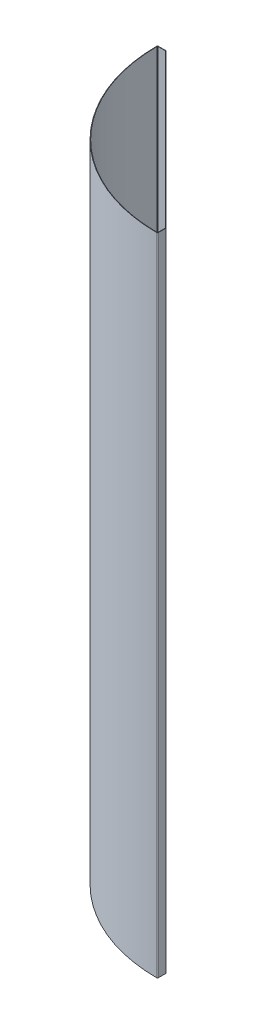
ISO-10303-21;
HEADER;
FILE_DESCRIPTION(('STEP AP214'),'2;1');
FILE_NAME('part.step','',(''),(''),'','','');
FILE_SCHEMA(('AUTOMOTIVE_DESIGN { 1 0 10303 214 1 1 1 1 }'));
ENDSEC;
DATA;
#1=APPLICATION_CONTEXT('core data for automotive mechanical design processes');
#2=APPLICATION_PROTOCOL_DEFINITION('international standard','automotive_design',2000,#1);
#3=PRODUCT_CONTEXT('',#1,'mechanical');
#4=PRODUCT('Part','Part','',(#3));
#5=PRODUCT_RELATED_PRODUCT_CATEGORY('part','',(#4));
#6=PRODUCT_DEFINITION_FORMATION('','',#4);
#7=PRODUCT_DEFINITION_CONTEXT('part definition',#1,'design');
#8=PRODUCT_DEFINITION('design','',#6,#7);
#9=PRODUCT_DEFINITION_SHAPE('','',#8);
#10=(LENGTH_UNIT() NAMED_UNIT(*) SI_UNIT(.MILLI.,.METRE.));
#11=(NAMED_UNIT(*) PLANE_ANGLE_UNIT() SI_UNIT($,.RADIAN.));
#12=(NAMED_UNIT(*) SI_UNIT($,.STERADIAN.) SOLID_ANGLE_UNIT());
#13=UNCERTAINTY_MEASURE_WITH_UNIT(LENGTH_MEASURE(1.E-05),#10,'distance_accuracy_value','');
#14=(GEOMETRIC_REPRESENTATION_CONTEXT(3) GLOBAL_UNCERTAINTY_ASSIGNED_CONTEXT((#13)) GLOBAL_UNIT_ASSIGNED_CONTEXT((#10,
#11,#12)) REPRESENTATION_CONTEXT('',''));
#15=CARTESIAN_POINT('',(0.,0.,0.));
#16=DIRECTION('',(0.,0.,1.));
#17=DIRECTION('',(1.,0.,0.));
#18=AXIS2_PLACEMENT_3D('',#15,#16,#17);
#19=CARTESIAN_POINT('',(-92.4999999999991,-999.5,92.4999999999996));
#20=DIRECTION('',(0.,1.,0.));
#21=DIRECTION('',(-0.999997106121887,0.,-0.00240577385725729));
#22=AXIS2_PLACEMENT_3D('',#19,#20,#21);
#23=PLANE('',#22);
#24=DIRECTION('',(-0.00240577385725768,0.,0.999997106121887));
#25=VECTOR('',#24,1.);
#26=CARTESIAN_POINT('',(-93.7028869286286,-999.5,592.498553060943));
#27=LINE('',#26,#25);
#28=CARTESIAN_POINT('',(-93.7028869286286,-999.5,592.498553060943));
#29=VERTEX_POINT('',#28);
#30=CARTESIAN_POINT('',(-93.7057738572573,-999.5,593.69854958829));
#31=VERTEX_POINT('',#30);
#32=EDGE_CURVE('E237',#29,#31,#27,.T.);
#33=ORIENTED_EDGE('',*,*,#32,.T.);
#34=CARTESIAN_POINT('',(-92.4999999999991,-999.5,92.4999999999996));
#35=DIRECTION('',(0.,1.,0.));
#36=DIRECTION('',(-0.999997106121887,0.,-0.00240577385725729));
#37=AXIS2_PLACEMENT_3D('',#34,#35,#36);
#38=CIRCLE('',#37,501.200000000001);
#39=CARTESIAN_POINT('',(-593.698549588289,-999.5,93.7057738572575));
#40=VERTEX_POINT('',#39);
#41=EDGE_CURVE('E56',#31,#40,#38,.F.);
#42=ORIENTED_EDGE('',*,*,#41,.T.);
#43=DIRECTION('',(0.999997106121887,0.,-0.00240577385724612));
#44=VECTOR('',#43,1.);
#45=CARTESIAN_POINT('',(-593.698549588289,-999.5,93.7057738572592));
#46=LINE('',#45,#44);
#47=CARTESIAN_POINT('',(-592.498553060943,-999.5,93.7028869286301));
#48=VERTEX_POINT('',#47);
#49=EDGE_CURVE('E242',#40,#48,#46,.T.);
#50=ORIENTED_EDGE('',*,*,#49,.T.);
#51=CARTESIAN_POINT('',(-92.4999999999991,-999.5,92.4999999999996));
#52=DIRECTION('',(0.,-1.,0.));
#53=DIRECTION('',(0.999997106121887,0.,0.00240577385725729));
#54=AXIS2_PLACEMENT_3D('',#51,#52,#53);
#55=CIRCLE('',#54,500.000000000001);
#56=EDGE_CURVE('E221',#29,#48,#55,.T.);
#57=ORIENTED_EDGE('',*,*,#56,.F.);
#58=EDGE_LOOP('',(#33,#42,#50,#57));
#59=FACE_BOUND('',#58,.T.);
#60=ADVANCED_FACE('F36',(#59),#23,.F.);
#61=CARTESIAN_POINT('',(-92.4999999999991,999.5,92.4999999999996));
#62=DIRECTION('',(0.,-1.,0.));
#63=DIRECTION('',(0.999997106121887,0.,0.00240577385725729));
#64=AXIS2_PLACEMENT_3D('',#61,#62,#63);
#65=PLANE('',#64);
#66=DIRECTION('',(-0.999997106121887,0.,0.00240577385724612));
#67=VECTOR('',#66,1.);
#68=CARTESIAN_POINT('',(-592.498553060944,999.5,93.7028869286296));
#69=LINE('',#68,#67);
#70=CARTESIAN_POINT('',(-592.498553060944,999.5,93.7028869286284));
#71=VERTEX_POINT('',#70);
#72=CARTESIAN_POINT('',(-593.69854958829,999.5,93.7057738572583));
#73=VERTEX_POINT('',#72);
#74=EDGE_CURVE('E11',#71,#73,#69,.T.);
#75=ORIENTED_EDGE('',*,*,#74,.T.);
#76=CARTESIAN_POINT('',(-92.4999999999991,999.499999999999,92.4999999999996));
#77=DIRECTION('',(0.,1.,0.));
#78=DIRECTION('',(-0.999997106121887,0.,-0.00240577385725729));
#79=AXIS2_PLACEMENT_3D('',#76,#77,#78);
#80=CIRCLE('',#79,501.200000000001);
#81=CARTESIAN_POINT('',(-93.7057738572573,999.5,593.69854958829));
#82=VERTEX_POINT('',#81);
#83=EDGE_CURVE('E225',#73,#82,#80,.T.);
#84=ORIENTED_EDGE('',*,*,#83,.T.);
#85=DIRECTION('',(0.00240577385725768,0.,-0.999997106121887));
#86=VECTOR('',#85,1.);
#87=CARTESIAN_POINT('',(-93.7057738572573,999.5,593.69854958829));
#88=LINE('',#87,#86);
#89=CARTESIAN_POINT('',(-93.7028869286286,999.5,592.498553060943));
#90=VERTEX_POINT('',#89);
#91=EDGE_CURVE('E233',#82,#90,#88,.T.);
#92=ORIENTED_EDGE('',*,*,#91,.T.);
#93=CARTESIAN_POINT('',(-92.4999999999991,999.5,92.4999999999996));
#94=DIRECTION('',(0.,1.,0.));
#95=DIRECTION('',(-0.999997106121887,0.,-0.00240577385725729));
#96=AXIS2_PLACEMENT_3D('',#93,#94,#95);
#97=CIRCLE('',#96,500.000000000001);
#98=EDGE_CURVE('E224',#71,#90,#97,.T.);
#99=ORIENTED_EDGE('',*,*,#98,.F.);
#100=EDGE_LOOP('',(#75,#84,#92,#99));
#101=FACE_BOUND('',#100,.T.);
#102=ADVANCED_FACE('F294',(#101),#65,.F.);
#103=CARTESIAN_POINT('',(-92.4999999999991,-2147.06405149988,92.4999999999996));
#104=DIRECTION('',(0.,1.,0.));
#105=DIRECTION('',(-0.999997106121887,0.,-0.00240577385725729));
#106=AXIS2_PLACEMENT_3D('',#103,#104,#105);
#107=CYLINDRICAL_SURFACE('',#106,500.000000000001);
#108=ORIENTED_EDGE('',*,*,#98,.T.);
#109=DIRECTION('',(0.,1.,0.));
#110=VECTOR('',#109,1.);
#111=CARTESIAN_POINT('',(-93.7028869286286,-999.5,592.498553060943));
#112=LINE('',#111,#110);
#113=EDGE_CURVE('E228',#29,#90,#112,.T.);
#114=ORIENTED_EDGE('',*,*,#113,.F.);
#115=ORIENTED_EDGE('',*,*,#56,.T.);
#116=DIRECTION('',(0.,1.,0.));
#117=VECTOR('',#116,1.);
#118=CARTESIAN_POINT('',(-592.498553060943,-999.5,93.7028869286305));
#119=LINE('',#118,#117);
#120=EDGE_CURVE('E239',#48,#71,#119,.T.);
#121=ORIENTED_EDGE('',*,*,#120,.T.);
#122=EDGE_LOOP('',(#108,#114,#115,#121));
#123=FACE_BOUND('',#122,.T.);
#124=ADVANCED_FACE('F265',(#123),#107,.F.);
#125=CARTESIAN_POINT('',(-92.4999999999991,-2147.06405149988,92.4999999999996));
#126=DIRECTION('',(0.,1.,0.));
#127=DIRECTION('',(-0.999997106121887,0.,-0.00240577385725729));
#128=AXIS2_PLACEMENT_3D('',#125,#126,#127);
#129=CYLINDRICAL_SURFACE('',#128,501.200000000001);
#130=ORIENTED_EDGE('',*,*,#83,.F.);
#131=DIRECTION('',(0.,1.,0.));
#132=VECTOR('',#131,1.);
#133=CARTESIAN_POINT('',(-593.698549588289,-999.5,93.7057738572592));
#134=LINE('',#133,#132);
#135=EDGE_CURVE('E43',#40,#73,#134,.T.);
#136=ORIENTED_EDGE('',*,*,#135,.F.);
#137=ORIENTED_EDGE('',*,*,#41,.F.);
#138=DIRECTION('',(0.,1.,0.));
#139=VECTOR('',#138,1.);
#140=CARTESIAN_POINT('',(-93.7057738572573,-999.5,593.69854958829));
#141=LINE('',#140,#139);
#142=EDGE_CURVE('E235',#31,#82,#141,.T.);
#143=ORIENTED_EDGE('',*,*,#142,.T.);
#144=EDGE_LOOP('',(#130,#136,#137,#143));
#145=FACE_BOUND('',#144,.T.);
#146=ADVANCED_FACE('F289',(#145),#129,.T.);
#147=CARTESIAN_POINT('',(-92.4999999999999,-999.5,567.5));
#148=DIRECTION('',(0.,0.,1.));
#149=DIRECTION('',(1.,0.,0.));
#150=AXIS2_PLACEMENT_3D('',#147,#148,#149);
#151=PLANE('',#150);
#152=DIRECTION('',(1.,0.,0.));
#153=VECTOR('',#152,1.);
#154=CARTESIAN_POINT('',(-92.4999999999999,999.5,567.5));
#155=LINE('',#154,#153);
#156=CARTESIAN_POINT('',(-92.4999999999999,999.5,567.5));
#157=VERTEX_POINT('',#156);
#158=CARTESIAN_POINT('',(-91.2999999999999,999.5,567.5));
#159=VERTEX_POINT('',#158);
#160=EDGE_CURVE('E217',#157,#159,#155,.T.);
#161=ORIENTED_EDGE('',*,*,#160,.T.);
#162=DIRECTION('',(0.,1.,0.));
#163=VECTOR('',#162,1.);
#164=CARTESIAN_POINT('',(-91.2999999999999,-999.5,567.5));
#165=LINE('',#164,#163);
#166=CARTESIAN_POINT('',(-91.2999999999999,-999.5,567.5));
#167=VERTEX_POINT('',#166);
#168=EDGE_CURVE('E198',#167,#159,#165,.T.);
#169=ORIENTED_EDGE('',*,*,#168,.F.);
#170=DIRECTION('',(1.,0.,0.));
#171=VECTOR('',#170,1.);
#172=CARTESIAN_POINT('',(-92.4999999999999,-999.5,567.5));
#173=LINE('',#172,#171);
#174=CARTESIAN_POINT('',(-92.4999999999999,-999.5,567.5));
#175=VERTEX_POINT('',#174);
#176=EDGE_CURVE('E191',#175,#167,#173,.T.);
#177=ORIENTED_EDGE('',*,*,#176,.F.);
#178=DIRECTION('',(0.,1.,0.));
#179=VECTOR('',#178,1.);
#180=CARTESIAN_POINT('',(-92.4999999999999,-999.5,567.5));
#181=LINE('',#180,#179);
#182=EDGE_CURVE('E214',#175,#157,#181,.T.);
#183=ORIENTED_EDGE('',*,*,#182,.T.);
#184=EDGE_LOOP('',(#161,#169,#177,#183));
#185=FACE_BOUND('',#184,.T.);
#186=ADVANCED_FACE('F303',(#185),#151,.F.);
#187=CARTESIAN_POINT('',(-92.4999999999999,-999.5,592.5));
#188=DIRECTION('',(1.,0.,0.));
#189=DIRECTION('',(0.,0.,-1.));
#190=AXIS2_PLACEMENT_3D('',#187,#188,#189);
#191=PLANE('',#190);
#192=DIRECTION('',(0.,0.,-1.));
#193=VECTOR('',#192,1.);
#194=CARTESIAN_POINT('',(-92.4999999999999,999.5,592.5));
#195=LINE('',#194,#193);
#196=CARTESIAN_POINT('',(-92.4999999999999,999.5,591.298556533597));
#197=VERTEX_POINT('',#196);
#198=EDGE_CURVE('E212',#197,#157,#195,.T.);
#199=ORIENTED_EDGE('',*,*,#198,.T.);
#200=ORIENTED_EDGE('',*,*,#182,.F.);
#201=DIRECTION('',(0.,0.,-1.));
#202=VECTOR('',#201,1.);
#203=CARTESIAN_POINT('',(-92.4999999999999,-999.5,592.5));
#204=LINE('',#203,#202);
#205=CARTESIAN_POINT('',(-92.4999999999999,-999.5,591.298556533597));
#206=VERTEX_POINT('',#205);
#207=EDGE_CURVE('E193',#206,#175,#204,.T.);
#208=ORIENTED_EDGE('',*,*,#207,.F.);
#209=DIRECTION('',(0.,1.,0.));
#210=VECTOR('',#209,1.);
#211=CARTESIAN_POINT('',(-92.4999999999999,-999.5,591.298556533597));
#212=LINE('',#211,#210);
#213=EDGE_CURVE('E209',#206,#197,#212,.T.);
#214=ORIENTED_EDGE('',*,*,#213,.T.);
#215=EDGE_LOOP('',(#199,#200,#208,#214));
#216=FACE_BOUND('',#215,.T.);
#217=ADVANCED_FACE('F279',(#216),#191,.F.);
#218=CARTESIAN_POINT('',(-93.7057738572574,999.5,593.69854958829));
#219=DIRECTION('',(0.,1.,0.));
#220=DIRECTION('',(0.,0.,1.));
#221=AXIS2_PLACEMENT_3D('',#218,#219,#220);
#222=PLANE('',#221);
#223=ORIENTED_EDGE('',*,*,#198,.F.);
#224=DIRECTION('',(1.,0.,0.));
#225=VECTOR('',#224,1.);
#226=CARTESIAN_POINT('',(-92.4999999999999,999.5,591.298556533597));
#227=LINE('',#226,#225);
#228=CARTESIAN_POINT('',(-91.2999999999999,999.5,591.298556533597));
#229=VERTEX_POINT('',#228);
#230=EDGE_CURVE('E206',#197,#229,#227,.T.);
#231=ORIENTED_EDGE('',*,*,#230,.T.);
#232=DIRECTION('',(0.,0.,-1.));
#233=VECTOR('',#232,1.);
#234=CARTESIAN_POINT('',(-91.2999999999999,999.5,592.5));
#235=LINE('',#234,#233);
#236=EDGE_CURVE('E203',#229,#159,#235,.T.);
#237=ORIENTED_EDGE('',*,*,#236,.T.);
#238=ORIENTED_EDGE('',*,*,#160,.F.);
#239=EDGE_LOOP('',(#223,#231,#237,#238));
#240=FACE_BOUND('',#239,.T.);
#241=ADVANCED_FACE('F310',(#240),#222,.T.);
#242=CARTESIAN_POINT('',(-91.2999999999999,-999.5,592.5));
#243=DIRECTION('',(1.,0.,0.));
#244=DIRECTION('',(0.,0.,-1.));
#245=AXIS2_PLACEMENT_3D('',#242,#243,#244);
#246=PLANE('',#245);
#247=ORIENTED_EDGE('',*,*,#236,.F.);
#248=DIRECTION('',(0.,1.,0.));
#249=VECTOR('',#248,1.);
#250=CARTESIAN_POINT('',(-91.2999999999999,-999.5,591.298556533597));
#251=LINE('',#250,#249);
#252=CARTESIAN_POINT('',(-91.2999999999999,-999.5,591.298556533597));
#253=VERTEX_POINT('',#252);
#254=EDGE_CURVE('E186',#253,#229,#251,.T.);
#255=ORIENTED_EDGE('',*,*,#254,.F.);
#256=DIRECTION('',(0.,0.,-1.));
#257=VECTOR('',#256,1.);
#258=CARTESIAN_POINT('',(-91.2999999999999,-999.5,592.5));
#259=LINE('',#258,#257);
#260=EDGE_CURVE('E200',#253,#167,#259,.T.);
#261=ORIENTED_EDGE('',*,*,#260,.T.);
#262=ORIENTED_EDGE('',*,*,#168,.T.);
#263=EDGE_LOOP('',(#247,#255,#261,#262));
#264=FACE_BOUND('',#263,.T.);
#265=ADVANCED_FACE('F307',(#264),#246,.T.);
#266=CARTESIAN_POINT('',(-93.6999999999999,-999.5,591.298556533597));
#267=DIRECTION('',(0.,1.,0.));
#268=DIRECTION('',(1.,0.,0.));
#269=AXIS2_PLACEMENT_3D('',#266,#267,#268);
#270=PLANE('',#269);
#271=ORIENTED_EDGE('',*,*,#260,.F.);
#272=DIRECTION('',(-1.,0.,0.));
#273=VECTOR('',#272,1.);
#274=CARTESIAN_POINT('',(-91.2999999999999,-999.5,591.298556533597));
#275=LINE('',#274,#273);
#276=EDGE_CURVE('E195',#253,#206,#275,.T.);
#277=ORIENTED_EDGE('',*,*,#276,.T.);
#278=ORIENTED_EDGE('',*,*,#207,.T.);
#279=ORIENTED_EDGE('',*,*,#176,.T.);
#280=EDGE_LOOP('',(#271,#277,#278,#279));
#281=FACE_BOUND('',#280,.T.);
#282=ADVANCED_FACE('F283',(#281),#270,.F.);
#283=CARTESIAN_POINT('',(-93.6999999999999,-999.5,591.298556533597));
#284=DIRECTION('',(0.,1.,0.));
#285=DIRECTION('',(0.,0.,1.));
#286=AXIS2_PLACEMENT_3D('',#283,#284,#285);
#287=PLANE('',#286);
#288=ORIENTED_EDGE('',*,*,#276,.F.);
#289=CARTESIAN_POINT('',(-93.6999999999999,-999.5,591.298556533597));
#290=DIRECTION('',(0.,1.,0.));
#291=DIRECTION('',(0.,0.,1.));
#292=AXIS2_PLACEMENT_3D('',#289,#290,#291);
#293=CIRCLE('',#292,2.4);
#294=EDGE_CURVE('E173',#253,#31,#293,.F.);
#295=ORIENTED_EDGE('',*,*,#294,.T.);
#296=ORIENTED_EDGE('',*,*,#32,.F.);
#297=CARTESIAN_POINT('',(-93.6999999999999,-999.5,591.298556533597));
#298=DIRECTION('',(0.,-1.,0.));
#299=DIRECTION('',(0.,0.,-1.));
#300=AXIS2_PLACEMENT_3D('',#297,#298,#299);
#301=CIRCLE('',#300,1.2);
#302=EDGE_CURVE('E179',#206,#29,#301,.T.);
#303=ORIENTED_EDGE('',*,*,#302,.F.);
#304=EDGE_LOOP('',(#288,#295,#296,#303));
#305=FACE_BOUND('',#304,.T.);
#306=ADVANCED_FACE('F270',(#305),#287,.F.);
#307=CARTESIAN_POINT('',(-93.6999999999999,999.5,591.298556533597));
#308=DIRECTION('',(0.,-1.,0.));
#309=DIRECTION('',(0.,0.,-1.));
#310=AXIS2_PLACEMENT_3D('',#307,#308,#309);
#311=PLANE('',#310);
#312=ORIENTED_EDGE('',*,*,#91,.F.);
#313=CARTESIAN_POINT('',(-93.6999999999999,999.5,591.298556533597));
#314=DIRECTION('',(0.,1.,0.));
#315=DIRECTION('',(0.,0.,1.));
#316=AXIS2_PLACEMENT_3D('',#313,#314,#315);
#317=CIRCLE('',#316,2.4);
#318=EDGE_CURVE('E183',#82,#229,#317,.T.);
#319=ORIENTED_EDGE('',*,*,#318,.T.);
#320=ORIENTED_EDGE('',*,*,#230,.F.);
#321=CARTESIAN_POINT('',(-93.6999999999999,999.5,591.298556533597));
#322=DIRECTION('',(0.,1.,0.));
#323=DIRECTION('',(0.,0.,1.));
#324=AXIS2_PLACEMENT_3D('',#321,#322,#323);
#325=CIRCLE('',#324,1.2);
#326=EDGE_CURVE('E182',#90,#197,#325,.T.);
#327=ORIENTED_EDGE('',*,*,#326,.F.);
#328=EDGE_LOOP('',(#312,#319,#320,#327));
#329=FACE_BOUND('',#328,.T.);
#330=ADVANCED_FACE('F291',(#329),#311,.F.);
#331=CARTESIAN_POINT('',(-93.6999999999999,-1999.00180545337,591.298556533597));
#332=DIRECTION('',(0.,1.,0.));
#333=DIRECTION('',(0.,0.,1.));
#334=AXIS2_PLACEMENT_3D('',#331,#332,#333);
#335=CYLINDRICAL_SURFACE('',#334,1.2);
#336=ORIENTED_EDGE('',*,*,#326,.T.);
#337=ORIENTED_EDGE('',*,*,#213,.F.);
#338=ORIENTED_EDGE('',*,*,#302,.T.);
#339=ORIENTED_EDGE('',*,*,#113,.T.);
#340=EDGE_LOOP('',(#336,#337,#338,#339));
#341=FACE_BOUND('',#340,.T.);
#342=ADVANCED_FACE('F274',(#341),#335,.F.);
#343=CARTESIAN_POINT('',(-93.6999999999999,-1999.00180545337,591.298556533597));
#344=DIRECTION('',(0.,1.,0.));
#345=DIRECTION('',(0.,0.,1.));
#346=AXIS2_PLACEMENT_3D('',#343,#344,#345);
#347=CYLINDRICAL_SURFACE('',#346,2.4);
#348=ORIENTED_EDGE('',*,*,#318,.F.);
#349=ORIENTED_EDGE('',*,*,#142,.F.);
#350=ORIENTED_EDGE('',*,*,#294,.F.);
#351=ORIENTED_EDGE('',*,*,#254,.T.);
#352=EDGE_LOOP('',(#348,#349,#350,#351));
#353=FACE_BOUND('',#352,.T.);
#354=ADVANCED_FACE('F287',(#353),#347,.T.);
#355=CARTESIAN_POINT('',(-591.298556533596,-999.5,93.7000000000018));
#356=DIRECTION('',(0.,1.,0.));
#357=DIRECTION('',(0.,0.,1.));
#358=AXIS2_PLACEMENT_3D('',#355,#356,#357);
#359=PLANE('',#358);
#360=ORIENTED_EDGE('',*,*,#49,.F.);
#361=CARTESIAN_POINT('',(-591.298556533596,-999.5,93.7000000000018));
#362=DIRECTION('',(0.,1.,0.));
#363=DIRECTION('',(0.,0.,1.));
#364=AXIS2_PLACEMENT_3D('',#361,#362,#363);
#365=CIRCLE('',#364,2.4);
#366=CARTESIAN_POINT('',(-591.298556533597,-999.5,91.3000000000026));
#367=VERTEX_POINT('',#366);
#368=EDGE_CURVE('E175',#40,#367,#365,.F.);
#369=ORIENTED_EDGE('',*,*,#368,.T.);
#370=DIRECTION('',(0.,0.,-1.));
#371=VECTOR('',#370,1.);
#372=CARTESIAN_POINT('',(-591.298556533597,-999.5,92.5000000000025));
#373=LINE('',#372,#371);
#374=CARTESIAN_POINT('',(-591.298556533598,-999.5,92.5000000000025));
#375=VERTEX_POINT('',#374);
#376=EDGE_CURVE('E146',#375,#367,#373,.T.);
#377=ORIENTED_EDGE('',*,*,#376,.F.);
#378=CARTESIAN_POINT('',(-591.298556533596,-999.5,93.7000000000018));
#379=DIRECTION('',(0.,-1.,0.));
#380=DIRECTION('',(0.,0.,-1.));
#381=AXIS2_PLACEMENT_3D('',#378,#379,#380);
#382=CIRCLE('',#381,1.2);
#383=EDGE_CURVE('E166',#48,#375,#382,.T.);
#384=ORIENTED_EDGE('',*,*,#383,.F.);
#385=EDGE_LOOP('',(#360,#369,#377,#384));
#386=FACE_BOUND('',#385,.T.);
#387=ADVANCED_FACE('F247',(#386),#359,.F.);
#388=CARTESIAN_POINT('',(-591.298556533597,999.5,93.7000000000009));
#389=DIRECTION('',(0.,-1.,0.));
#390=DIRECTION('',(0.,0.,-1.));
#391=AXIS2_PLACEMENT_3D('',#388,#389,#390);
#392=PLANE('',#391);
#393=DIRECTION('',(0.,0.,1.));
#394=VECTOR('',#393,1.);
#395=CARTESIAN_POINT('',(-591.298556533597,999.5,91.3000000000008));
#396=LINE('',#395,#394);
#397=CARTESIAN_POINT('',(-591.298556533597,999.5,91.3000000000008));
#398=VERTEX_POINT('',#397);
#399=CARTESIAN_POINT('',(-591.298556533598,999.499999999999,92.5000000000009));
#400=VERTEX_POINT('',#399);
#401=EDGE_CURVE('E178',#398,#400,#396,.T.);
#402=ORIENTED_EDGE('',*,*,#401,.F.);
#403=CARTESIAN_POINT('',(-591.298556533597,999.499999999999,93.7000000000009));
#404=DIRECTION('',(0.,1.,0.));
#405=DIRECTION('',(0.,0.,1.));
#406=AXIS2_PLACEMENT_3D('',#403,#404,#405);
#407=CIRCLE('',#406,2.4);
#408=EDGE_CURVE('E170',#398,#73,#407,.T.);
#409=ORIENTED_EDGE('',*,*,#408,.T.);
#410=ORIENTED_EDGE('',*,*,#74,.F.);
#411=CARTESIAN_POINT('',(-591.298556533597,999.5,93.7000000000009));
#412=DIRECTION('',(0.,1.,0.));
#413=DIRECTION('',(0.,0.,1.));
#414=AXIS2_PLACEMENT_3D('',#411,#412,#413);
#415=CIRCLE('',#414,1.2);
#416=EDGE_CURVE('E169',#400,#71,#415,.T.);
#417=ORIENTED_EDGE('',*,*,#416,.F.);
#418=EDGE_LOOP('',(#402,#409,#410,#417));
#419=FACE_BOUND('',#418,.T.);
#420=ADVANCED_FACE('F253',(#419),#392,.F.);
#421=CARTESIAN_POINT('',(-591.298556533596,-1999.00181239638,93.7000000000022));
#422=DIRECTION('',(0.,1.,0.));
#423=DIRECTION('',(0.,0.,1.));
#424=AXIS2_PLACEMENT_3D('',#421,#422,#423);
#425=CYLINDRICAL_SURFACE('',#424,1.2);
#426=ORIENTED_EDGE('',*,*,#416,.T.);
#427=ORIENTED_EDGE('',*,*,#120,.F.);
#428=ORIENTED_EDGE('',*,*,#383,.T.);
#429=DIRECTION('',(0.,1.,0.));
#430=VECTOR('',#429,1.);
#431=CARTESIAN_POINT('',(-591.298556533597,-999.5,92.5000000000025));
#432=LINE('',#431,#430);
#433=EDGE_CURVE('E163',#375,#400,#432,.T.);
#434=ORIENTED_EDGE('',*,*,#433,.T.);
#435=EDGE_LOOP('',(#426,#427,#428,#434));
#436=FACE_BOUND('',#435,.T.);
#437=ADVANCED_FACE('F262',(#436),#425,.F.);
#438=CARTESIAN_POINT('',(-591.298556533596,-1999.00181239638,93.7000000000022));
#439=DIRECTION('',(0.,1.,0.));
#440=DIRECTION('',(0.,0.,1.));
#441=AXIS2_PLACEMENT_3D('',#438,#439,#440);
#442=CYLINDRICAL_SURFACE('',#441,2.4);
#443=ORIENTED_EDGE('',*,*,#408,.F.);
#444=DIRECTION('',(0.,1.,0.));
#445=VECTOR('',#444,1.);
#446=CARTESIAN_POINT('',(-591.298556533597,-999.5,91.3000000000026));
#447=LINE('',#446,#445);
#448=EDGE_CURVE('E151',#367,#398,#447,.T.);
#449=ORIENTED_EDGE('',*,*,#448,.F.);
#450=ORIENTED_EDGE('',*,*,#368,.F.);
#451=ORIENTED_EDGE('',*,*,#135,.T.);
#452=EDGE_LOOP('',(#443,#449,#450,#451));
#453=FACE_BOUND('',#452,.T.);
#454=ADVANCED_FACE('F249',(#453),#442,.T.);
#455=CARTESIAN_POINT('',(-567.5,-999.5,91.3000000000025));
#456=DIRECTION('',(-1.,0.,0.));
#457=DIRECTION('',(0.,0.,1.));
#458=AXIS2_PLACEMENT_3D('',#455,#456,#457);
#459=PLANE('',#458);
#460=DIRECTION('',(0.,0.,1.));
#461=VECTOR('',#460,1.);
#462=CARTESIAN_POINT('',(-567.5,999.5,91.3000000000007));
#463=LINE('',#462,#461);
#464=CARTESIAN_POINT('',(-567.5,999.5,91.3000000000007));
#465=VERTEX_POINT('',#464);
#466=CARTESIAN_POINT('',(-567.5,999.5,92.5000000000008));
#467=VERTEX_POINT('',#466);
#468=EDGE_CURVE('E136',#465,#467,#463,.T.);
#469=ORIENTED_EDGE('',*,*,#468,.T.);
#470=DIRECTION('',(0.,1.,0.));
#471=VECTOR('',#470,1.);
#472=CARTESIAN_POINT('',(-567.5,-999.5,92.5000000000026));
#473=LINE('',#472,#471);
#474=CARTESIAN_POINT('',(-567.5,-999.5,92.5000000000026));
#475=VERTEX_POINT('',#474);
#476=EDGE_CURVE('E142',#475,#467,#473,.T.);
#477=ORIENTED_EDGE('',*,*,#476,.F.);
#478=DIRECTION('',(0.,0.,1.));
#479=VECTOR('',#478,1.);
#480=CARTESIAN_POINT('',(-567.5,-999.5,91.3000000000025));
#481=LINE('',#480,#479);
#482=CARTESIAN_POINT('',(-567.5,-999.5,91.3000000000025));
#483=VERTEX_POINT('',#482);
#484=EDGE_CURVE('E139',#483,#475,#481,.T.);
#485=ORIENTED_EDGE('',*,*,#484,.F.);
#486=DIRECTION('',(0.,1.,0.));
#487=VECTOR('',#486,1.);
#488=CARTESIAN_POINT('',(-567.5,-999.5,91.3000000000025));
#489=LINE('',#488,#487);
#490=EDGE_CURVE('E125',#483,#465,#489,.T.);
#491=ORIENTED_EDGE('',*,*,#490,.T.);
#492=EDGE_LOOP('',(#469,#477,#485,#491));
#493=FACE_BOUND('',#492,.T.);
#494=ADVANCED_FACE('F140',(#493),#459,.F.);
#495=CARTESIAN_POINT('',(-592.5,-999.5,92.5000000000024));
#496=DIRECTION('',(0.,0.,-1.));
#497=DIRECTION('',(-1.,0.,0.));
#498=AXIS2_PLACEMENT_3D('',#495,#496,#497);
#499=PLANE('',#498);
#500=DIRECTION('',(-1.,0.,0.));
#501=VECTOR('',#500,1.);
#502=CARTESIAN_POINT('',(-592.5,999.5,92.5000000000006));
#503=LINE('',#502,#501);
#504=EDGE_CURVE('E135',#467,#400,#503,.T.);
#505=ORIENTED_EDGE('',*,*,#504,.T.);
#506=ORIENTED_EDGE('',*,*,#433,.F.);
#507=DIRECTION('',(-1.,0.,0.));
#508=VECTOR('',#507,1.);
#509=CARTESIAN_POINT('',(-592.5,-999.5,92.5000000000024));
#510=LINE('',#509,#508);
#511=EDGE_CURVE('E157',#475,#375,#510,.T.);
#512=ORIENTED_EDGE('',*,*,#511,.F.);
#513=ORIENTED_EDGE('',*,*,#476,.T.);
#514=EDGE_LOOP('',(#505,#506,#512,#513));
#515=FACE_BOUND('',#514,.T.);
#516=ADVANCED_FACE('F260',(#515),#499,.F.);
#517=CARTESIAN_POINT('',(-593.69854958829,-999.5,93.7057738572595));
#518=DIRECTION('',(0.,-1.,0.));
#519=DIRECTION('',(0.,0.,-1.));
#520=AXIS2_PLACEMENT_3D('',#517,#518,#519);
#521=PLANE('',#520);
#522=ORIENTED_EDGE('',*,*,#511,.T.);
#523=ORIENTED_EDGE('',*,*,#376,.T.);
#524=DIRECTION('',(1.,0.,0.));
#525=VECTOR('',#524,1.);
#526=CARTESIAN_POINT('',(-592.5,-999.5,91.3000000000025));
#527=LINE('',#526,#525);
#528=EDGE_CURVE('E130',#483,#367,#527,.F.);
#529=ORIENTED_EDGE('',*,*,#528,.F.);
#530=ORIENTED_EDGE('',*,*,#484,.T.);
#531=EDGE_LOOP('',(#522,#523,#529,#530));
#532=FACE_BOUND('',#531,.T.);
#533=ADVANCED_FACE('F148',(#532),#521,.T.);
#534=CARTESIAN_POINT('',(-592.5,-999.5,91.3000000000025));
#535=DIRECTION('',(0.,0.,-1.));
#536=DIRECTION('',(-1.,0.,0.));
#537=AXIS2_PLACEMENT_3D('',#534,#535,#536);
#538=PLANE('',#537);
#539=DIRECTION('',(1.,0.,0.));
#540=VECTOR('',#539,1.);
#541=CARTESIAN_POINT('',(-592.5,999.5,91.3000000000007));
#542=LINE('',#541,#540);
#543=EDGE_CURVE('E132',#465,#398,#542,.F.);
#544=ORIENTED_EDGE('',*,*,#543,.F.);
#545=ORIENTED_EDGE('',*,*,#490,.F.);
#546=ORIENTED_EDGE('',*,*,#528,.T.);
#547=ORIENTED_EDGE('',*,*,#448,.T.);
#548=EDGE_LOOP('',(#544,#545,#546,#547));
#549=FACE_BOUND('',#548,.T.);
#550=ADVANCED_FACE('F127',(#549),#538,.T.);
#551=CARTESIAN_POINT('',(-93.6999999999997,999.5,591.298556533598));
#552=DIRECTION('',(0.,1.,0.));
#553=DIRECTION('',(1.,0.,0.));
#554=AXIS2_PLACEMENT_3D('',#551,#552,#553);
#555=PLANE('',#554);
#556=ORIENTED_EDGE('',*,*,#543,.T.);
#557=ORIENTED_EDGE('',*,*,#401,.T.);
#558=ORIENTED_EDGE('',*,*,#504,.F.);
#559=ORIENTED_EDGE('',*,*,#468,.F.);
#560=EDGE_LOOP('',(#556,#557,#558,#559));
#561=FACE_BOUND('',#560,.T.);
#562=ADVANCED_FACE('F258',(#561),#555,.T.);
#563=CLOSED_SHELL('',(#60,#102,#124,#146,#186,#217,#241,#265,#282,#306,#330,#342,#354,#387,#420,
#437,#454,#494,#516,#533,#550,#562));
#564=MANIFOLD_SOLID_BREP('B2',#563);
#565=ADVANCED_BREP_SHAPE_REPRESENTATION('',(#18,#564),#14);
#566=SHAPE_DEFINITION_REPRESENTATION(#9,#565);
ENDSEC;
END-ISO-10303-21;
